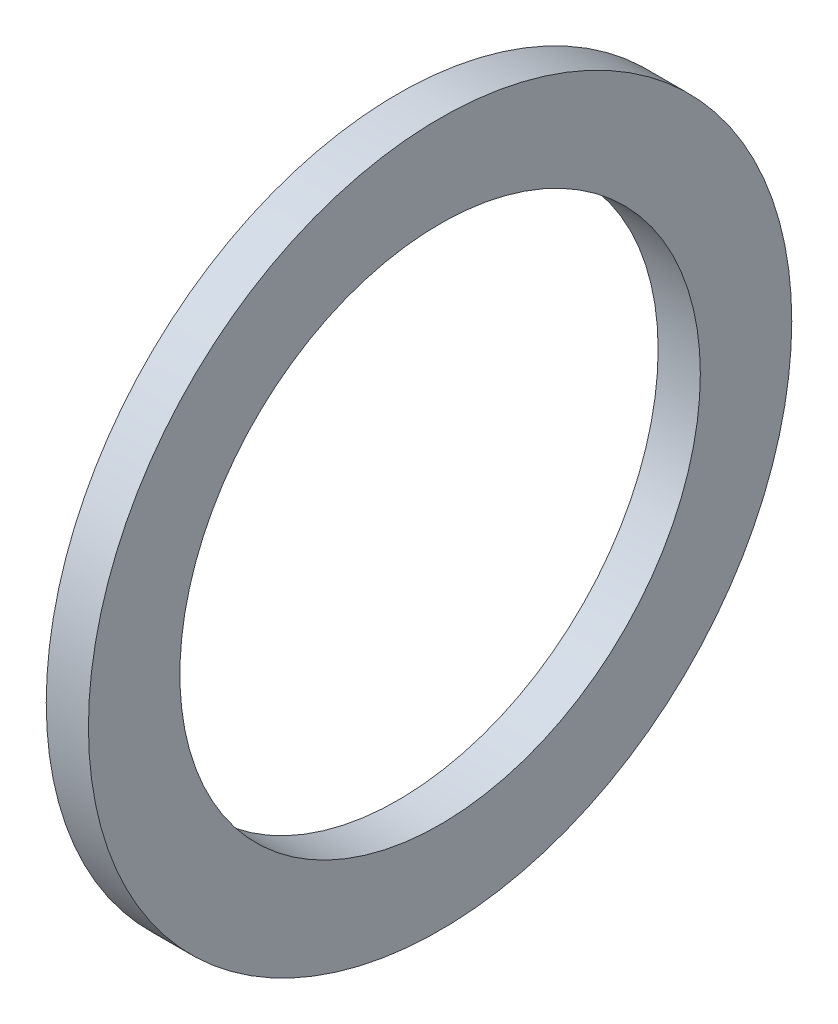
ISO-10303-21;
HEADER;
FILE_DESCRIPTION(('STEP AP214'),'2;1');
FILE_NAME('part.step','',(''),(''),'','','');
FILE_SCHEMA(('AUTOMOTIVE_DESIGN { 1 0 10303 214 1 1 1 1 }'));
ENDSEC;
DATA;
#1=APPLICATION_CONTEXT('core data for automotive mechanical design processes');
#2=APPLICATION_PROTOCOL_DEFINITION('international standard','automotive_design',2000,#1);
#3=PRODUCT_CONTEXT('',#1,'mechanical');
#4=PRODUCT('Part','Part','',(#3));
#5=PRODUCT_RELATED_PRODUCT_CATEGORY('part','',(#4));
#6=PRODUCT_DEFINITION_FORMATION('','',#4);
#7=PRODUCT_DEFINITION_CONTEXT('part definition',#1,'design');
#8=PRODUCT_DEFINITION('design','',#6,#7);
#9=PRODUCT_DEFINITION_SHAPE('','',#8);
#10=(LENGTH_UNIT() NAMED_UNIT(*) SI_UNIT(.MILLI.,.METRE.));
#11=(NAMED_UNIT(*) PLANE_ANGLE_UNIT() SI_UNIT($,.RADIAN.));
#12=(NAMED_UNIT(*) SI_UNIT($,.STERADIAN.) SOLID_ANGLE_UNIT());
#13=UNCERTAINTY_MEASURE_WITH_UNIT(LENGTH_MEASURE(1.E-05),#10,'distance_accuracy_value','');
#14=(GEOMETRIC_REPRESENTATION_CONTEXT(3) GLOBAL_UNCERTAINTY_ASSIGNED_CONTEXT((#13)) GLOBAL_UNIT_ASSIGNED_CONTEXT((#10,
#11,#12)) REPRESENTATION_CONTEXT('',''));
#15=CARTESIAN_POINT('',(0.,0.,0.));
#16=DIRECTION('',(0.,0.,1.));
#17=DIRECTION('',(1.,0.,0.));
#18=AXIS2_PLACEMENT_3D('',#15,#16,#17);
#19=CARTESIAN_POINT('',(-40.5,80.6,0.));
#20=DIRECTION('',(1.,0.,0.));
#21=DIRECTION('',(0.,0.,-1.));
#22=AXIS2_PLACEMENT_3D('',#19,#20,#21);
#23=CYLINDRICAL_SURFACE('',#22,3.7);
#24=DIRECTION('',(1.,0.,0.));
#25=VECTOR('',#24,1.);
#26=CARTESIAN_POINT('',(-40.5,80.6,-3.7));
#27=LINE('',#26,#25);
#28=CARTESIAN_POINT('',(-40.4,80.6,-3.7));
#29=VERTEX_POINT('',#28);
#30=CARTESIAN_POINT('',(-39.8,80.6,-3.7));
#31=VERTEX_POINT('',#30);
#32=EDGE_CURVE('E9',#29,#31,#27,.T.);
#33=ORIENTED_EDGE('',*,*,#32,.F.);
#34=CARTESIAN_POINT('',(-40.4,80.6,0.));
#35=DIRECTION('',(1.,0.,0.));
#36=DIRECTION('',(0.,0.,-1.));
#37=AXIS2_PLACEMENT_3D('',#34,#35,#36);
#38=CIRCLE('',#37,3.7);
#39=EDGE_CURVE('E25',#29,#29,#38,.T.);
#40=ORIENTED_EDGE('',*,*,#39,.F.);
#41=ORIENTED_EDGE('',*,*,#32,.T.);
#42=CARTESIAN_POINT('',(-39.8,80.6,0.));
#43=DIRECTION('',(1.,0.,0.));
#44=DIRECTION('',(0.,0.,-1.));
#45=AXIS2_PLACEMENT_3D('',#42,#43,#44);
#46=CIRCLE('',#45,3.7);
#47=EDGE_CURVE('E18',#31,#31,#46,.T.);
#48=ORIENTED_EDGE('',*,*,#47,.T.);
#49=EDGE_LOOP('',(#33,#40,#41,#48));
#50=FACE_BOUND('',#49,.T.);
#51=ADVANCED_FACE('F14',(#50),#23,.F.);
#52=CARTESIAN_POINT('',(-40.4,80.6,0.));
#53=DIRECTION('',(1.,0.,0.));
#54=DIRECTION('',(0.,0.,1.));
#55=AXIS2_PLACEMENT_3D('',#52,#53,#54);
#56=PLANE('',#55);
#57=ORIENTED_EDGE('',*,*,#39,.T.);
#58=EDGE_LOOP('',(#57));
#59=FACE_BOUND('',#58,.T.);
#60=CARTESIAN_POINT('',(-40.4,80.6,0.));
#61=DIRECTION('',(1.,0.,0.));
#62=DIRECTION('',(0.,0.,-1.));
#63=AXIS2_PLACEMENT_3D('',#60,#61,#62);
#64=CIRCLE('',#63,5.);
#65=CARTESIAN_POINT('',(-40.4,80.6,-5.));
#66=VERTEX_POINT('',#65);
#67=EDGE_CURVE('E53',#66,#66,#64,.T.);
#68=ORIENTED_EDGE('',*,*,#67,.F.);
#69=EDGE_LOOP('',(#68));
#70=FACE_BOUND('',#69,.T.);
#71=ADVANCED_FACE('F16',(#59,#70),#56,.F.);
#72=CARTESIAN_POINT('',(-39.8,80.6,0.));
#73=DIRECTION('',(1.,0.,0.));
#74=DIRECTION('',(0.,0.,1.));
#75=AXIS2_PLACEMENT_3D('',#72,#73,#74);
#76=PLANE('',#75);
#77=ORIENTED_EDGE('',*,*,#47,.F.);
#78=EDGE_LOOP('',(#77));
#79=FACE_BOUND('',#78,.T.);
#80=CARTESIAN_POINT('',(-39.8,80.6,0.));
#81=DIRECTION('',(1.,0.,0.));
#82=DIRECTION('',(0.,0.,-1.));
#83=AXIS2_PLACEMENT_3D('',#80,#81,#82);
#84=CIRCLE('',#83,5.);
#85=CARTESIAN_POINT('',(-39.8,80.6,-5.));
#86=VERTEX_POINT('',#85);
#87=EDGE_CURVE('E60',#86,#86,#84,.T.);
#88=ORIENTED_EDGE('',*,*,#87,.T.);
#89=EDGE_LOOP('',(#88));
#90=FACE_BOUND('',#89,.T.);
#91=ADVANCED_FACE('F70',(#79,#90),#76,.T.);
#92=CARTESIAN_POINT('',(-40.4,80.6,0.));
#93=DIRECTION('',(1.,0.,0.));
#94=DIRECTION('',(0.,0.,-1.));
#95=AXIS2_PLACEMENT_3D('',#92,#93,#94);
#96=CYLINDRICAL_SURFACE('',#95,5.);
#97=ORIENTED_EDGE('',*,*,#87,.F.);
#98=DIRECTION('',(1.,0.,0.));
#99=VECTOR('',#98,1.);
#100=CARTESIAN_POINT('',(-40.4,80.6,-5.));
#101=LINE('',#100,#99);
#102=EDGE_CURVE('E48',#66,#86,#101,.T.);
#103=ORIENTED_EDGE('',*,*,#102,.F.);
#104=ORIENTED_EDGE('',*,*,#67,.T.);
#105=ORIENTED_EDGE('',*,*,#102,.T.);
#106=EDGE_LOOP('',(#97,#103,#104,#105));
#107=FACE_BOUND('',#106,.T.);
#108=ADVANCED_FACE('F54',(#107),#96,.T.);
#109=CLOSED_SHELL('',(#51,#71,#91,#108));
#110=MANIFOLD_SOLID_BREP('B1',#109);
#111=ADVANCED_BREP_SHAPE_REPRESENTATION('',(#18,#110),#14);
#112=SHAPE_DEFINITION_REPRESENTATION(#9,#111);
ENDSEC;
END-ISO-10303-21;
